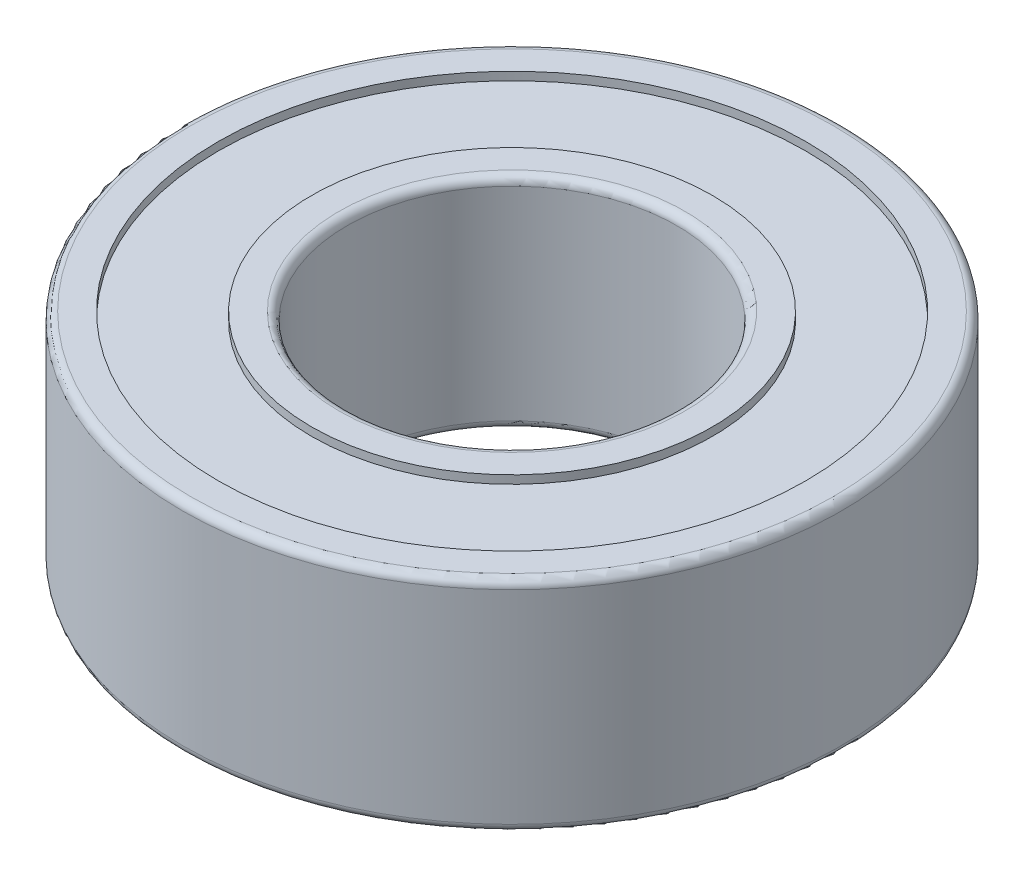
ISO-10303-21;
HEADER;
FILE_DESCRIPTION(('STEP AP214'),'2;1');
FILE_NAME('part.step','',(''),(''),'','','');
FILE_SCHEMA(('AUTOMOTIVE_DESIGN { 1 0 10303 214 1 1 1 1 }'));
ENDSEC;
DATA;
#1=APPLICATION_CONTEXT('core data for automotive mechanical design processes');
#2=APPLICATION_PROTOCOL_DEFINITION('international standard','automotive_design',2000,#1);
#3=PRODUCT_CONTEXT('',#1,'mechanical');
#4=PRODUCT('Part','Part','',(#3));
#5=PRODUCT_RELATED_PRODUCT_CATEGORY('part','',(#4));
#6=PRODUCT_DEFINITION_FORMATION('','',#4);
#7=PRODUCT_DEFINITION_CONTEXT('part definition',#1,'design');
#8=PRODUCT_DEFINITION('design','',#6,#7);
#9=PRODUCT_DEFINITION_SHAPE('','',#8);
#10=(LENGTH_UNIT() NAMED_UNIT(*) SI_UNIT(.MILLI.,.METRE.));
#11=(NAMED_UNIT(*) PLANE_ANGLE_UNIT() SI_UNIT($,.RADIAN.));
#12=(NAMED_UNIT(*) SI_UNIT($,.STERADIAN.) SOLID_ANGLE_UNIT());
#13=UNCERTAINTY_MEASURE_WITH_UNIT(LENGTH_MEASURE(1.E-05),#10,'distance_accuracy_value','');
#14=(GEOMETRIC_REPRESENTATION_CONTEXT(3) GLOBAL_UNCERTAINTY_ASSIGNED_CONTEXT((#13)) GLOBAL_UNIT_ASSIGNED_CONTEXT((#10,
#11,#12)) REPRESENTATION_CONTEXT('',''));
#15=CARTESIAN_POINT('',(0.,0.,0.));
#16=DIRECTION('',(0.,0.,1.));
#17=DIRECTION('',(1.,0.,0.));
#18=AXIS2_PLACEMENT_3D('',#15,#16,#17);
#19=CARTESIAN_POINT('',(0.,-1.85,0.));
#20=DIRECTION('',(0.,1.,0.));
#21=DIRECTION('',(0.,0.,1.));
#22=AXIS2_PLACEMENT_3D('',#19,#20,#21);
#23=TOROIDAL_SURFACE('',#22,3.15,0.149999999999999);
#24=CARTESIAN_POINT('',(0.,-1.85,0.));
#25=DIRECTION('',(0.,1.,0.));
#26=DIRECTION('',(0.,0.,1.));
#27=AXIS2_PLACEMENT_3D('',#24,#25,#26);
#28=CIRCLE('',#27,3.);
#29=CARTESIAN_POINT('',(0.,-1.85,3.));
#30=VERTEX_POINT('',#29);
#31=EDGE_CURVE('E10',#30,#30,#28,.T.);
#32=ORIENTED_EDGE('',*,*,#31,.T.);
#33=EDGE_LOOP('',(#32));
#34=FACE_BOUND('',#33,.T.);
#35=CARTESIAN_POINT('',(0.,-2.,0.));
#36=DIRECTION('',(0.,1.,0.));
#37=DIRECTION('',(0.,0.,1.));
#38=AXIS2_PLACEMENT_3D('',#35,#36,#37);
#39=CIRCLE('',#38,3.15);
#40=CARTESIAN_POINT('',(0.,-2.,3.15));
#41=VERTEX_POINT('',#40);
#42=EDGE_CURVE('E84',#41,#41,#39,.T.);
#43=ORIENTED_EDGE('',*,*,#42,.F.);
#44=EDGE_LOOP('',(#43));
#45=FACE_BOUND('',#44,.T.);
#46=ADVANCED_FACE('F32',(#34,#45),#23,.T.);
#47=CARTESIAN_POINT('',(0.,-2.00344606578273,0.));
#48=DIRECTION('',(0.,1.,0.));
#49=DIRECTION('',(0.,0.,1.));
#50=AXIS2_PLACEMENT_3D('',#47,#48,#49);
#51=CYLINDRICAL_SURFACE('',#50,3.);
#52=CARTESIAN_POINT('',(0.,1.85,0.));
#53=DIRECTION('',(0.,1.,0.));
#54=DIRECTION('',(0.,0.,1.));
#55=AXIS2_PLACEMENT_3D('',#52,#53,#54);
#56=CIRCLE('',#55,3.);
#57=CARTESIAN_POINT('',(0.,1.85,3.));
#58=VERTEX_POINT('',#57);
#59=EDGE_CURVE('E38',#58,#58,#56,.T.);
#60=ORIENTED_EDGE('',*,*,#59,.T.);
#61=EDGE_LOOP('',(#60));
#62=FACE_BOUND('',#61,.T.);
#63=ORIENTED_EDGE('',*,*,#31,.F.);
#64=EDGE_LOOP('',(#63));
#65=FACE_BOUND('',#64,.T.);
#66=ADVANCED_FACE('F92',(#62,#65),#51,.F.);
#67=CARTESIAN_POINT('',(0.,1.85,0.));
#68=DIRECTION('',(0.,1.,0.));
#69=DIRECTION('',(0.,0.,1.));
#70=AXIS2_PLACEMENT_3D('',#67,#68,#69);
#71=TOROIDAL_SURFACE('',#70,3.15,0.149999999999999);
#72=CARTESIAN_POINT('',(0.,2.,0.));
#73=DIRECTION('',(0.,1.,0.));
#74=DIRECTION('',(0.,0.,1.));
#75=AXIS2_PLACEMENT_3D('',#72,#73,#74);
#76=CIRCLE('',#75,3.15);
#77=CARTESIAN_POINT('',(0.,2.,3.15));
#78=VERTEX_POINT('',#77);
#79=EDGE_CURVE('E42',#78,#78,#76,.T.);
#80=ORIENTED_EDGE('',*,*,#79,.T.);
#81=EDGE_LOOP('',(#80));
#82=FACE_BOUND('',#81,.T.);
#83=ORIENTED_EDGE('',*,*,#59,.F.);
#84=EDGE_LOOP('',(#83));
#85=FACE_BOUND('',#84,.T.);
#86=ADVANCED_FACE('F96',(#82,#85),#71,.T.);
#87=CARTESIAN_POINT('',(3.15,2.,0.));
#88=DIRECTION('',(0.,1.,0.));
#89=DIRECTION('',(0.,0.,1.));
#90=AXIS2_PLACEMENT_3D('',#87,#88,#89);
#91=PLANE('',#90);
#92=CARTESIAN_POINT('',(0.,2.,0.));
#93=DIRECTION('',(0.,1.,0.));
#94=DIRECTION('',(0.,0.,1.));
#95=AXIS2_PLACEMENT_3D('',#92,#93,#94);
#96=CIRCLE('',#95,3.65);
#97=CARTESIAN_POINT('',(0.,2.,3.65));
#98=VERTEX_POINT('',#97);
#99=EDGE_CURVE('E46',#98,#98,#96,.T.);
#100=ORIENTED_EDGE('',*,*,#99,.T.);
#101=EDGE_LOOP('',(#100));
#102=FACE_BOUND('',#101,.T.);
#103=ORIENTED_EDGE('',*,*,#79,.F.);
#104=EDGE_LOOP('',(#103));
#105=FACE_BOUND('',#104,.T.);
#106=ADVANCED_FACE('F100',(#102,#105),#91,.T.);
#107=CARTESIAN_POINT('',(0.,-2.00344606578273,0.));
#108=DIRECTION('',(0.,1.,0.));
#109=DIRECTION('',(0.,0.,1.));
#110=AXIS2_PLACEMENT_3D('',#107,#108,#109);
#111=CYLINDRICAL_SURFACE('',#110,3.65);
#112=CARTESIAN_POINT('',(0.,1.85,0.));
#113=DIRECTION('',(0.,1.,0.));
#114=DIRECTION('',(0.,0.,1.));
#115=AXIS2_PLACEMENT_3D('',#112,#113,#114);
#116=CIRCLE('',#115,3.65);
#117=CARTESIAN_POINT('',(0.,1.85,3.65));
#118=VERTEX_POINT('',#117);
#119=EDGE_CURVE('E51',#118,#118,#116,.T.);
#120=ORIENTED_EDGE('',*,*,#119,.T.);
#121=EDGE_LOOP('',(#120));
#122=FACE_BOUND('',#121,.T.);
#123=ORIENTED_EDGE('',*,*,#99,.F.);
#124=EDGE_LOOP('',(#123));
#125=FACE_BOUND('',#124,.T.);
#126=ADVANCED_FACE('F107',(#122,#125),#111,.T.);
#127=CARTESIAN_POINT('',(3.65,1.85,0.));
#128=DIRECTION('',(0.,1.,0.));
#129=DIRECTION('',(0.,0.,1.));
#130=AXIS2_PLACEMENT_3D('',#127,#128,#129);
#131=PLANE('',#130);
#132=CARTESIAN_POINT('',(0.,1.85,0.));
#133=DIRECTION('',(0.,1.,0.));
#134=DIRECTION('',(0.,0.,1.));
#135=AXIS2_PLACEMENT_3D('',#132,#133,#134);
#136=CIRCLE('',#135,5.35);
#137=CARTESIAN_POINT('',(0.,1.85,5.35));
#138=VERTEX_POINT('',#137);
#139=EDGE_CURVE('E54',#138,#138,#136,.T.);
#140=ORIENTED_EDGE('',*,*,#139,.T.);
#141=EDGE_LOOP('',(#140));
#142=FACE_BOUND('',#141,.T.);
#143=ORIENTED_EDGE('',*,*,#119,.F.);
#144=EDGE_LOOP('',(#143));
#145=FACE_BOUND('',#144,.T.);
#146=ADVANCED_FACE('F111',(#142,#145),#131,.T.);
#147=CARTESIAN_POINT('',(0.,-2.00344606578273,0.));
#148=DIRECTION('',(0.,1.,0.));
#149=DIRECTION('',(0.,0.,1.));
#150=AXIS2_PLACEMENT_3D('',#147,#148,#149);
#151=CYLINDRICAL_SURFACE('',#150,5.35);
#152=CARTESIAN_POINT('',(0.,2.,0.));
#153=DIRECTION('',(0.,1.,0.));
#154=DIRECTION('',(0.,0.,1.));
#155=AXIS2_PLACEMENT_3D('',#152,#153,#154);
#156=CIRCLE('',#155,5.35);
#157=CARTESIAN_POINT('',(0.,2.,5.35));
#158=VERTEX_POINT('',#157);
#159=EDGE_CURVE('E57',#158,#158,#156,.T.);
#160=ORIENTED_EDGE('',*,*,#159,.T.);
#161=EDGE_LOOP('',(#160));
#162=FACE_BOUND('',#161,.T.);
#163=ORIENTED_EDGE('',*,*,#139,.F.);
#164=EDGE_LOOP('',(#163));
#165=FACE_BOUND('',#164,.T.);
#166=ADVANCED_FACE('F115',(#162,#165),#151,.F.);
#167=CARTESIAN_POINT('',(5.35,2.,0.));
#168=DIRECTION('',(0.,1.,0.));
#169=DIRECTION('',(0.,0.,1.));
#170=AXIS2_PLACEMENT_3D('',#167,#168,#169);
#171=PLANE('',#170);
#172=CARTESIAN_POINT('',(0.,2.,0.));
#173=DIRECTION('',(0.,1.,0.));
#174=DIRECTION('',(0.,0.,1.));
#175=AXIS2_PLACEMENT_3D('',#172,#173,#174);
#176=CIRCLE('',#175,5.85);
#177=CARTESIAN_POINT('',(0.,2.,5.85));
#178=VERTEX_POINT('',#177);
#179=EDGE_CURVE('E60',#178,#178,#176,.T.);
#180=ORIENTED_EDGE('',*,*,#179,.T.);
#181=EDGE_LOOP('',(#180));
#182=FACE_BOUND('',#181,.T.);
#183=ORIENTED_EDGE('',*,*,#159,.F.);
#184=EDGE_LOOP('',(#183));
#185=FACE_BOUND('',#184,.T.);
#186=ADVANCED_FACE('F119',(#182,#185),#171,.T.);
#187=CARTESIAN_POINT('',(0.,1.85,0.));
#188=DIRECTION('',(0.,1.,0.));
#189=DIRECTION('',(0.,0.,1.));
#190=AXIS2_PLACEMENT_3D('',#187,#188,#189);
#191=TOROIDAL_SURFACE('',#190,5.85,0.149999999999999);
#192=CARTESIAN_POINT('',(0.,1.85,0.));
#193=DIRECTION('',(0.,1.,0.));
#194=DIRECTION('',(0.,0.,1.));
#195=AXIS2_PLACEMENT_3D('',#192,#193,#194);
#196=CIRCLE('',#195,6.);
#197=CARTESIAN_POINT('',(0.,1.85,6.));
#198=VERTEX_POINT('',#197);
#199=EDGE_CURVE('E63',#198,#198,#196,.T.);
#200=ORIENTED_EDGE('',*,*,#199,.T.);
#201=EDGE_LOOP('',(#200));
#202=FACE_BOUND('',#201,.T.);
#203=ORIENTED_EDGE('',*,*,#179,.F.);
#204=EDGE_LOOP('',(#203));
#205=FACE_BOUND('',#204,.T.);
#206=ADVANCED_FACE('F123',(#202,#205),#191,.T.);
#207=CARTESIAN_POINT('',(0.,-2.00344606578273,0.));
#208=DIRECTION('',(0.,1.,0.));
#209=DIRECTION('',(0.,0.,1.));
#210=AXIS2_PLACEMENT_3D('',#207,#208,#209);
#211=CYLINDRICAL_SURFACE('',#210,6.);
#212=CARTESIAN_POINT('',(0.,-1.85,0.));
#213=DIRECTION('',(0.,1.,0.));
#214=DIRECTION('',(0.,0.,1.));
#215=AXIS2_PLACEMENT_3D('',#212,#213,#214);
#216=CIRCLE('',#215,6.);
#217=CARTESIAN_POINT('',(0.,-1.85,6.));
#218=VERTEX_POINT('',#217);
#219=EDGE_CURVE('E66',#218,#218,#216,.T.);
#220=ORIENTED_EDGE('',*,*,#219,.T.);
#221=EDGE_LOOP('',(#220));
#222=FACE_BOUND('',#221,.T.);
#223=ORIENTED_EDGE('',*,*,#199,.F.);
#224=EDGE_LOOP('',(#223));
#225=FACE_BOUND('',#224,.T.);
#226=ADVANCED_FACE('F127',(#222,#225),#211,.T.);
#227=CARTESIAN_POINT('',(0.,-1.85,0.));
#228=DIRECTION('',(0.,1.,0.));
#229=DIRECTION('',(0.,0.,1.));
#230=AXIS2_PLACEMENT_3D('',#227,#228,#229);
#231=TOROIDAL_SURFACE('',#230,5.85,0.149999999999999);
#232=CARTESIAN_POINT('',(0.,-2.,0.));
#233=DIRECTION('',(0.,1.,0.));
#234=DIRECTION('',(0.,0.,1.));
#235=AXIS2_PLACEMENT_3D('',#232,#233,#234);
#236=CIRCLE('',#235,5.85);
#237=CARTESIAN_POINT('',(0.,-2.,5.85));
#238=VERTEX_POINT('',#237);
#239=EDGE_CURVE('E69',#238,#238,#236,.T.);
#240=ORIENTED_EDGE('',*,*,#239,.T.);
#241=EDGE_LOOP('',(#240));
#242=FACE_BOUND('',#241,.T.);
#243=ORIENTED_EDGE('',*,*,#219,.F.);
#244=EDGE_LOOP('',(#243));
#245=FACE_BOUND('',#244,.T.);
#246=ADVANCED_FACE('F131',(#242,#245),#231,.T.);
#247=CARTESIAN_POINT('',(5.85,-2.,0.));
#248=DIRECTION('',(0.,-1.,0.));
#249=DIRECTION('',(0.,0.,-1.));
#250=AXIS2_PLACEMENT_3D('',#247,#248,#249);
#251=PLANE('',#250);
#252=CARTESIAN_POINT('',(0.,-2.,0.));
#253=DIRECTION('',(0.,1.,0.));
#254=DIRECTION('',(0.,0.,1.));
#255=AXIS2_PLACEMENT_3D('',#252,#253,#254);
#256=CIRCLE('',#255,5.35);
#257=CARTESIAN_POINT('',(0.,-2.,5.35));
#258=VERTEX_POINT('',#257);
#259=EDGE_CURVE('E72',#258,#258,#256,.T.);
#260=ORIENTED_EDGE('',*,*,#259,.T.);
#261=EDGE_LOOP('',(#260));
#262=FACE_BOUND('',#261,.T.);
#263=ORIENTED_EDGE('',*,*,#239,.F.);
#264=EDGE_LOOP('',(#263));
#265=FACE_BOUND('',#264,.T.);
#266=ADVANCED_FACE('F135',(#262,#265),#251,.T.);
#267=CARTESIAN_POINT('',(0.,-2.00344606578273,0.));
#268=DIRECTION('',(0.,1.,0.));
#269=DIRECTION('',(0.,0.,1.));
#270=AXIS2_PLACEMENT_3D('',#267,#268,#269);
#271=CYLINDRICAL_SURFACE('',#270,5.35);
#272=CARTESIAN_POINT('',(0.,-1.85,0.));
#273=DIRECTION('',(0.,1.,0.));
#274=DIRECTION('',(0.,0.,1.));
#275=AXIS2_PLACEMENT_3D('',#272,#273,#274);
#276=CIRCLE('',#275,5.35);
#277=CARTESIAN_POINT('',(0.,-1.85,5.35));
#278=VERTEX_POINT('',#277);
#279=EDGE_CURVE('E75',#278,#278,#276,.T.);
#280=ORIENTED_EDGE('',*,*,#279,.T.);
#281=EDGE_LOOP('',(#280));
#282=FACE_BOUND('',#281,.T.);
#283=ORIENTED_EDGE('',*,*,#259,.F.);
#284=EDGE_LOOP('',(#283));
#285=FACE_BOUND('',#284,.T.);
#286=ADVANCED_FACE('F139',(#282,#285),#271,.F.);
#287=CARTESIAN_POINT('',(5.35,-1.85,0.));
#288=DIRECTION('',(0.,-1.,0.));
#289=DIRECTION('',(0.,0.,-1.));
#290=AXIS2_PLACEMENT_3D('',#287,#288,#289);
#291=PLANE('',#290);
#292=CARTESIAN_POINT('',(0.,-1.85,0.));
#293=DIRECTION('',(0.,1.,0.));
#294=DIRECTION('',(0.,0.,1.));
#295=AXIS2_PLACEMENT_3D('',#292,#293,#294);
#296=CIRCLE('',#295,3.65);
#297=CARTESIAN_POINT('',(0.,-1.85,3.65));
#298=VERTEX_POINT('',#297);
#299=EDGE_CURVE('E78',#298,#298,#296,.T.);
#300=ORIENTED_EDGE('',*,*,#299,.T.);
#301=EDGE_LOOP('',(#300));
#302=FACE_BOUND('',#301,.T.);
#303=ORIENTED_EDGE('',*,*,#279,.F.);
#304=EDGE_LOOP('',(#303));
#305=FACE_BOUND('',#304,.T.);
#306=ADVANCED_FACE('F143',(#302,#305),#291,.T.);
#307=CARTESIAN_POINT('',(0.,-2.00344606578273,0.));
#308=DIRECTION('',(0.,1.,0.));
#309=DIRECTION('',(0.,0.,1.));
#310=AXIS2_PLACEMENT_3D('',#307,#308,#309);
#311=CYLINDRICAL_SURFACE('',#310,3.65);
#312=CARTESIAN_POINT('',(0.,-2.,0.));
#313=DIRECTION('',(0.,1.,0.));
#314=DIRECTION('',(0.,0.,1.));
#315=AXIS2_PLACEMENT_3D('',#312,#313,#314);
#316=CIRCLE('',#315,3.65);
#317=CARTESIAN_POINT('',(0.,-2.,3.65));
#318=VERTEX_POINT('',#317);
#319=EDGE_CURVE('E81',#318,#318,#316,.T.);
#320=ORIENTED_EDGE('',*,*,#319,.T.);
#321=EDGE_LOOP('',(#320));
#322=FACE_BOUND('',#321,.T.);
#323=ORIENTED_EDGE('',*,*,#299,.F.);
#324=EDGE_LOOP('',(#323));
#325=FACE_BOUND('',#324,.T.);
#326=ADVANCED_FACE('F147',(#322,#325),#311,.T.);
#327=CARTESIAN_POINT('',(3.65,-2.,0.));
#328=DIRECTION('',(0.,-1.,0.));
#329=DIRECTION('',(0.,0.,-1.));
#330=AXIS2_PLACEMENT_3D('',#327,#328,#329);
#331=PLANE('',#330);
#332=ORIENTED_EDGE('',*,*,#42,.T.);
#333=EDGE_LOOP('',(#332));
#334=FACE_BOUND('',#333,.T.);
#335=ORIENTED_EDGE('',*,*,#319,.F.);
#336=EDGE_LOOP('',(#335));
#337=FACE_BOUND('',#336,.T.);
#338=ADVANCED_FACE('F88',(#334,#337),#331,.T.);
#339=CLOSED_SHELL('',(#46,#66,#86,#106,#126,#146,#166,#186,#206,#226,#246,#266,#286,#306,#326,#338));
#340=MANIFOLD_SOLID_BREP('B2',#339);
#341=ADVANCED_BREP_SHAPE_REPRESENTATION('',(#18,#340),#14);
#342=SHAPE_DEFINITION_REPRESENTATION(#9,#341);
ENDSEC;
END-ISO-10303-21;
